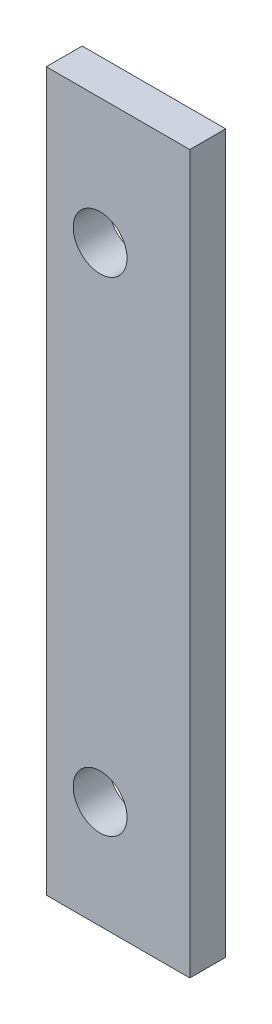
ISO-10303-21;
HEADER;
FILE_DESCRIPTION(('STEP AP214'),'2;1');
FILE_NAME('part.step','',(''),(''),'','','');
FILE_SCHEMA(('AUTOMOTIVE_DESIGN { 1 0 10303 214 1 1 1 1 }'));
ENDSEC;
DATA;
#1=APPLICATION_CONTEXT('core data for automotive mechanical design processes');
#2=APPLICATION_PROTOCOL_DEFINITION('international standard','automotive_design',2000,#1);
#3=PRODUCT_CONTEXT('',#1,'mechanical');
#4=PRODUCT('Part','Part','',(#3));
#5=PRODUCT_RELATED_PRODUCT_CATEGORY('part','',(#4));
#6=PRODUCT_DEFINITION_FORMATION('','',#4);
#7=PRODUCT_DEFINITION_CONTEXT('part definition',#1,'design');
#8=PRODUCT_DEFINITION('design','',#6,#7);
#9=PRODUCT_DEFINITION_SHAPE('','',#8);
#10=(LENGTH_UNIT() NAMED_UNIT(*) SI_UNIT(.MILLI.,.METRE.));
#11=(NAMED_UNIT(*) PLANE_ANGLE_UNIT() SI_UNIT($,.RADIAN.));
#12=(NAMED_UNIT(*) SI_UNIT($,.STERADIAN.) SOLID_ANGLE_UNIT());
#13=UNCERTAINTY_MEASURE_WITH_UNIT(LENGTH_MEASURE(1.E-05),#10,'distance_accuracy_value','');
#14=(GEOMETRIC_REPRESENTATION_CONTEXT(3) GLOBAL_UNCERTAINTY_ASSIGNED_CONTEXT((#13)) GLOBAL_UNIT_ASSIGNED_CONTEXT((#10,
#11,#12)) REPRESENTATION_CONTEXT('',''));
#15=CARTESIAN_POINT('',(0.,0.,0.));
#16=DIRECTION('',(0.,0.,1.));
#17=DIRECTION('',(1.,0.,0.));
#18=AXIS2_PLACEMENT_3D('',#15,#16,#17);
#19=CARTESIAN_POINT('',(-4.,-20.,2.));
#20=DIRECTION('',(1.,0.,0.));
#21=DIRECTION('',(0.,1.,0.));
#22=AXIS2_PLACEMENT_3D('',#19,#20,#21);
#23=PLANE('',#22);
#24=DIRECTION('',(0.,-1.,0.));
#25=VECTOR('',#24,1.);
#26=CARTESIAN_POINT('',(-4.,-20.,0.));
#27=LINE('',#26,#25);
#28=CARTESIAN_POINT('',(-4.,20.,0.));
#29=VERTEX_POINT('',#28);
#30=CARTESIAN_POINT('',(-4.,-20.,0.));
#31=VERTEX_POINT('',#30);
#32=EDGE_CURVE('E107',#29,#31,#27,.T.);
#33=ORIENTED_EDGE('',*,*,#32,.T.);
#34=DIRECTION('',(0.,0.,-1.));
#35=VECTOR('',#34,1.);
#36=CARTESIAN_POINT('',(-4.,-20.,2.));
#37=LINE('',#36,#35);
#38=CARTESIAN_POINT('',(-4.,-20.,2.));
#39=VERTEX_POINT('',#38);
#40=EDGE_CURVE('E11',#39,#31,#37,.T.);
#41=ORIENTED_EDGE('',*,*,#40,.F.);
#42=DIRECTION('',(0.,-1.,0.));
#43=VECTOR('',#42,1.);
#44=CARTESIAN_POINT('',(-4.,-20.,2.));
#45=LINE('',#44,#43);
#46=CARTESIAN_POINT('',(-4.,20.,2.));
#47=VERTEX_POINT('',#46);
#48=EDGE_CURVE('E91',#47,#39,#45,.T.);
#49=ORIENTED_EDGE('',*,*,#48,.F.);
#50=DIRECTION('',(0.,0.,-1.));
#51=VECTOR('',#50,1.);
#52=CARTESIAN_POINT('',(-4.,20.,2.));
#53=LINE('',#52,#51);
#54=EDGE_CURVE('E103',#47,#29,#53,.T.);
#55=ORIENTED_EDGE('',*,*,#54,.T.);
#56=EDGE_LOOP('',(#33,#41,#49,#55));
#57=FACE_BOUND('',#56,.T.);
#58=ADVANCED_FACE('F39',(#57),#23,.F.);
#59=CARTESIAN_POINT('',(4.,-20.,2.));
#60=DIRECTION('',(0.,1.,0.));
#61=DIRECTION('',(-1.,0.,0.));
#62=AXIS2_PLACEMENT_3D('',#59,#60,#61);
#63=PLANE('',#62);
#64=DIRECTION('',(1.,0.,0.));
#65=VECTOR('',#64,1.);
#66=CARTESIAN_POINT('',(4.,-20.,0.));
#67=LINE('',#66,#65);
#68=CARTESIAN_POINT('',(4.,-20.,0.));
#69=VERTEX_POINT('',#68);
#70=EDGE_CURVE('E96',#31,#69,#67,.T.);
#71=ORIENTED_EDGE('',*,*,#70,.T.);
#72=DIRECTION('',(0.,0.,-1.));
#73=VECTOR('',#72,1.);
#74=CARTESIAN_POINT('',(4.,-20.,2.));
#75=LINE('',#74,#73);
#76=CARTESIAN_POINT('',(4.,-20.,2.));
#77=VERTEX_POINT('',#76);
#78=EDGE_CURVE('E48',#77,#69,#75,.T.);
#79=ORIENTED_EDGE('',*,*,#78,.F.);
#80=DIRECTION('',(1.,0.,0.));
#81=VECTOR('',#80,1.);
#82=CARTESIAN_POINT('',(4.,-20.,2.));
#83=LINE('',#82,#81);
#84=EDGE_CURVE('E86',#39,#77,#83,.T.);
#85=ORIENTED_EDGE('',*,*,#84,.F.);
#86=ORIENTED_EDGE('',*,*,#40,.T.);
#87=EDGE_LOOP('',(#71,#79,#85,#86));
#88=FACE_BOUND('',#87,.T.);
#89=ADVANCED_FACE('F95',(#88),#63,.F.);
#90=CARTESIAN_POINT('',(4.,-20.,2.));
#91=DIRECTION('',(-1.,0.,0.));
#92=DIRECTION('',(0.,-1.,0.));
#93=AXIS2_PLACEMENT_3D('',#90,#91,#92);
#94=PLANE('',#93);
#95=DIRECTION('',(0.,1.,0.));
#96=VECTOR('',#95,1.);
#97=CARTESIAN_POINT('',(4.,-20.,0.));
#98=LINE('',#97,#96);
#99=CARTESIAN_POINT('',(4.,20.,0.));
#100=VERTEX_POINT('',#99);
#101=EDGE_CURVE('E73',#69,#100,#98,.T.);
#102=ORIENTED_EDGE('',*,*,#101,.T.);
#103=DIRECTION('',(0.,0.,-1.));
#104=VECTOR('',#103,1.);
#105=CARTESIAN_POINT('',(4.,20.,2.));
#106=LINE('',#105,#104);
#107=CARTESIAN_POINT('',(4.,20.,2.));
#108=VERTEX_POINT('',#107);
#109=EDGE_CURVE('E98',#108,#100,#106,.T.);
#110=ORIENTED_EDGE('',*,*,#109,.F.);
#111=DIRECTION('',(0.,1.,0.));
#112=VECTOR('',#111,1.);
#113=CARTESIAN_POINT('',(4.,-20.,2.));
#114=LINE('',#113,#112);
#115=EDGE_CURVE('E89',#77,#108,#114,.T.);
#116=ORIENTED_EDGE('',*,*,#115,.F.);
#117=ORIENTED_EDGE('',*,*,#78,.T.);
#118=EDGE_LOOP('',(#102,#110,#116,#117));
#119=FACE_BOUND('',#118,.T.);
#120=ADVANCED_FACE('F99',(#119),#94,.F.);
#121=CARTESIAN_POINT('',(4.,20.,2.));
#122=DIRECTION('',(0.,-1.,0.));
#123=DIRECTION('',(0.,0.,-1.));
#124=AXIS2_PLACEMENT_3D('',#121,#122,#123);
#125=PLANE('',#124);
#126=DIRECTION('',(-1.,0.,0.));
#127=VECTOR('',#126,1.);
#128=CARTESIAN_POINT('',(4.,20.,0.));
#129=LINE('',#128,#127);
#130=EDGE_CURVE('E79',#100,#29,#129,.T.);
#131=ORIENTED_EDGE('',*,*,#130,.T.);
#132=ORIENTED_EDGE('',*,*,#54,.F.);
#133=DIRECTION('',(-1.,0.,0.));
#134=VECTOR('',#133,1.);
#135=CARTESIAN_POINT('',(4.,20.,2.));
#136=LINE('',#135,#134);
#137=EDGE_CURVE('E56',#108,#47,#136,.T.);
#138=ORIENTED_EDGE('',*,*,#137,.F.);
#139=ORIENTED_EDGE('',*,*,#109,.T.);
#140=EDGE_LOOP('',(#131,#132,#138,#139));
#141=FACE_BOUND('',#140,.T.);
#142=ADVANCED_FACE('F121',(#141),#125,.F.);
#143=CARTESIAN_POINT('',(0.,0.,2.));
#144=DIRECTION('',(0.,0.,1.));
#145=DIRECTION('',(1.,0.,0.));
#146=AXIS2_PLACEMENT_3D('',#143,#144,#145);
#147=PLANE('',#146);
#148=CARTESIAN_POINT('',(-1.,-14.,2.));
#149=DIRECTION('',(0.,0.,1.));
#150=DIRECTION('',(1.,0.,0.));
#151=AXIS2_PLACEMENT_3D('',#148,#149,#150);
#152=CIRCLE('',#151,1.5);
#153=CARTESIAN_POINT('',(0.499999999999999,-14.,2.));
#154=VERTEX_POINT('',#153);
#155=EDGE_CURVE('E136',#154,#154,#152,.T.);
#156=ORIENTED_EDGE('',*,*,#155,.F.);
#157=EDGE_LOOP('',(#156));
#158=FACE_BOUND('',#157,.T.);
#159=CARTESIAN_POINT('',(-1.,13.,2.));
#160=DIRECTION('',(0.,0.,1.));
#161=DIRECTION('',(1.,0.,0.));
#162=AXIS2_PLACEMENT_3D('',#159,#160,#161);
#163=CIRCLE('',#162,1.5);
#164=CARTESIAN_POINT('',(0.499999999999999,13.,2.));
#165=VERTEX_POINT('',#164);
#166=EDGE_CURVE('E128',#165,#165,#163,.T.);
#167=ORIENTED_EDGE('',*,*,#166,.F.);
#168=EDGE_LOOP('',(#167));
#169=FACE_BOUND('',#168,.T.);
#170=ORIENTED_EDGE('',*,*,#48,.T.);
#171=ORIENTED_EDGE('',*,*,#84,.T.);
#172=ORIENTED_EDGE('',*,*,#115,.T.);
#173=ORIENTED_EDGE('',*,*,#137,.T.);
#174=EDGE_LOOP('',(#170,#171,#172,#173));
#175=FACE_BOUND('',#174,.T.);
#176=ADVANCED_FACE('F87',(#158,#169,#175),#147,.T.);
#177=CARTESIAN_POINT('',(0.,0.,0.));
#178=DIRECTION('',(0.,0.,1.));
#179=DIRECTION('',(1.,0.,0.));
#180=AXIS2_PLACEMENT_3D('',#177,#178,#179);
#181=PLANE('',#180);
#182=CARTESIAN_POINT('',(-1.,-14.,0.));
#183=DIRECTION('',(0.,0.,1.));
#184=DIRECTION('',(1.,0.,0.));
#185=AXIS2_PLACEMENT_3D('',#182,#183,#184);
#186=CIRCLE('',#185,1.5);
#187=CARTESIAN_POINT('',(0.499999999999999,-14.,0.));
#188=VERTEX_POINT('',#187);
#189=EDGE_CURVE('E111',#188,#188,#186,.T.);
#190=ORIENTED_EDGE('',*,*,#189,.T.);
#191=EDGE_LOOP('',(#190));
#192=FACE_BOUND('',#191,.T.);
#193=CARTESIAN_POINT('',(-1.,13.,0.));
#194=DIRECTION('',(0.,0.,1.));
#195=DIRECTION('',(1.,0.,0.));
#196=AXIS2_PLACEMENT_3D('',#193,#194,#195);
#197=CIRCLE('',#196,1.5);
#198=CARTESIAN_POINT('',(0.499999999999999,13.,0.));
#199=VERTEX_POINT('',#198);
#200=EDGE_CURVE('E132',#199,#199,#197,.T.);
#201=ORIENTED_EDGE('',*,*,#200,.T.);
#202=EDGE_LOOP('',(#201));
#203=FACE_BOUND('',#202,.T.);
#204=ORIENTED_EDGE('',*,*,#32,.F.);
#205=ORIENTED_EDGE('',*,*,#130,.F.);
#206=ORIENTED_EDGE('',*,*,#101,.F.);
#207=ORIENTED_EDGE('',*,*,#70,.F.);
#208=EDGE_LOOP('',(#204,#205,#206,#207));
#209=FACE_BOUND('',#208,.T.);
#210=ADVANCED_FACE('F124',(#192,#203,#209),#181,.F.);
#211=CARTESIAN_POINT('',(-1.,13.,0.));
#212=DIRECTION('',(0.,0.,1.));
#213=DIRECTION('',(1.,0.,0.));
#214=AXIS2_PLACEMENT_3D('',#211,#212,#213);
#215=CYLINDRICAL_SURFACE('',#214,1.5);
#216=ORIENTED_EDGE('',*,*,#200,.F.);
#217=EDGE_LOOP('',(#216));
#218=FACE_BOUND('',#217,.T.);
#219=ORIENTED_EDGE('',*,*,#166,.T.);
#220=EDGE_LOOP('',(#219));
#221=FACE_BOUND('',#220,.T.);
#222=ADVANCED_FACE('F149',(#218,#221),#215,.F.);
#223=CARTESIAN_POINT('',(-1.,-14.,0.));
#224=DIRECTION('',(0.,0.,1.));
#225=DIRECTION('',(1.,0.,0.));
#226=AXIS2_PLACEMENT_3D('',#223,#224,#225);
#227=CYLINDRICAL_SURFACE('',#226,1.5);
#228=ORIENTED_EDGE('',*,*,#189,.F.);
#229=EDGE_LOOP('',(#228));
#230=FACE_BOUND('',#229,.T.);
#231=ORIENTED_EDGE('',*,*,#155,.T.);
#232=EDGE_LOOP('',(#231));
#233=FACE_BOUND('',#232,.T.);
#234=ADVANCED_FACE('F146',(#230,#233),#227,.F.);
#235=CLOSED_SHELL('',(#58,#89,#120,#142,#176,#210,#222,#234));
#236=MANIFOLD_SOLID_BREP('B2',#235);
#237=ADVANCED_BREP_SHAPE_REPRESENTATION('',(#18,#236),#14);
#238=SHAPE_DEFINITION_REPRESENTATION(#9,#237);
ENDSEC;
END-ISO-10303-21;
